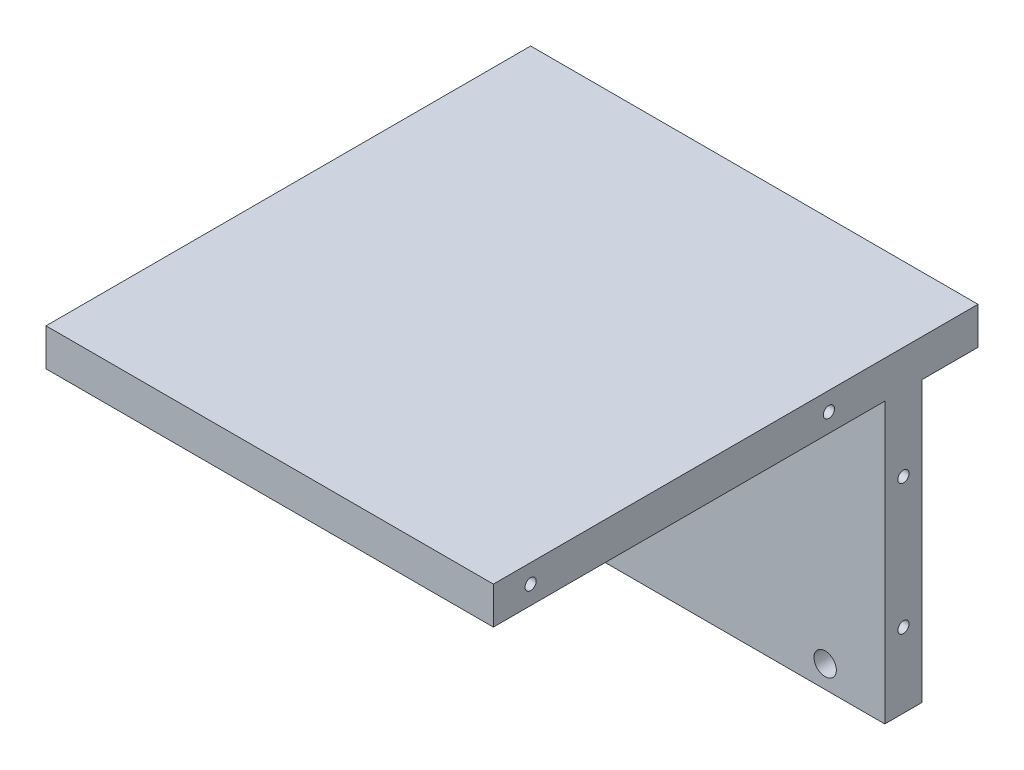
ISO-10303-21;
HEADER;
FILE_DESCRIPTION(('STEP AP214'),'2;1');
FILE_NAME('part.step','',(''),(''),'','','');
FILE_SCHEMA(('AUTOMOTIVE_DESIGN { 1 0 10303 214 1 1 1 1 }'));
ENDSEC;
DATA;
#1=APPLICATION_CONTEXT('core data for automotive mechanical design processes');
#2=APPLICATION_PROTOCOL_DEFINITION('international standard','automotive_design',2000,#1);
#3=PRODUCT_CONTEXT('',#1,'mechanical');
#4=PRODUCT('Part','Part','',(#3));
#5=PRODUCT_RELATED_PRODUCT_CATEGORY('part','',(#4));
#6=PRODUCT_DEFINITION_FORMATION('','',#4);
#7=PRODUCT_DEFINITION_CONTEXT('part definition',#1,'design');
#8=PRODUCT_DEFINITION('design','',#6,#7);
#9=PRODUCT_DEFINITION_SHAPE('','',#8);
#10=(LENGTH_UNIT() NAMED_UNIT(*) SI_UNIT(.MILLI.,.METRE.));
#11=(NAMED_UNIT(*) PLANE_ANGLE_UNIT() SI_UNIT($,.RADIAN.));
#12=(NAMED_UNIT(*) SI_UNIT($,.STERADIAN.) SOLID_ANGLE_UNIT());
#13=UNCERTAINTY_MEASURE_WITH_UNIT(LENGTH_MEASURE(1.E-05),#10,'distance_accuracy_value','');
#14=(GEOMETRIC_REPRESENTATION_CONTEXT(3) GLOBAL_UNCERTAINTY_ASSIGNED_CONTEXT((#13)) GLOBAL_UNIT_ASSIGNED_CONTEXT((#10,
#11,#12)) REPRESENTATION_CONTEXT('',''));
#15=CARTESIAN_POINT('',(0.,0.,0.));
#16=DIRECTION('',(0.,0.,1.));
#17=DIRECTION('',(1.,0.,0.));
#18=AXIS2_PLACEMENT_3D('',#15,#16,#17);
#19=CARTESIAN_POINT('',(0.,0.,10.));
#20=DIRECTION('',(0.,0.,1.));
#21=DIRECTION('',(1.,0.,0.));
#22=AXIS2_PLACEMENT_3D('',#19,#20,#21);
#23=PLANE('',#22);
#24=CARTESIAN_POINT('',(2.09489001666563E-13,-10.,10.));
#25=DIRECTION('',(0.,0.,1.));
#26=DIRECTION('',(1.,0.,0.));
#27=AXIS2_PLACEMENT_3D('',#24,#25,#26);
#28=CIRCLE('',#27,2.5);
#29=CARTESIAN_POINT('',(2.50000000000021,-10.,10.));
#30=VERTEX_POINT('',#29);
#31=EDGE_CURVE('E168',#30,#30,#28,.T.);
#32=ORIENTED_EDGE('',*,*,#31,.F.);
#33=EDGE_LOOP('',(#32));
#34=FACE_BOUND('',#33,.T.);
#35=CARTESIAN_POINT('',(0.,10.,10.));
#36=DIRECTION('',(0.,0.,1.));
#37=DIRECTION('',(1.,0.,0.));
#38=AXIS2_PLACEMENT_3D('',#35,#36,#37);
#39=CIRCLE('',#38,2.5);
#40=CARTESIAN_POINT('',(2.5,10.,10.));
#41=VERTEX_POINT('',#40);
#42=EDGE_CURVE('E162',#41,#41,#39,.T.);
#43=ORIENTED_EDGE('',*,*,#42,.F.);
#44=EDGE_LOOP('',(#43));
#45=FACE_BOUND('',#44,.T.);
#46=CARTESIAN_POINT('',(-43.9999999999993,-31.5,10.));
#47=DIRECTION('',(0.,0.,1.));
#48=DIRECTION('',(1.,0.,0.));
#49=AXIS2_PLACEMENT_3D('',#46,#47,#48);
#50=CIRCLE('',#49,3.);
#51=CARTESIAN_POINT('',(-40.9999999999993,-31.5,10.));
#52=VERTEX_POINT('',#51);
#53=EDGE_CURVE('E147',#52,#52,#50,.T.);
#54=ORIENTED_EDGE('',*,*,#53,.F.);
#55=EDGE_LOOP('',(#54));
#56=FACE_BOUND('',#55,.T.);
#57=CARTESIAN_POINT('',(-44.,31.5,10.));
#58=DIRECTION('',(0.,0.,1.));
#59=DIRECTION('',(1.,0.,0.));
#60=AXIS2_PLACEMENT_3D('',#57,#58,#59);
#61=CIRCLE('',#60,3.);
#62=CARTESIAN_POINT('',(-41.,31.5,10.));
#63=VERTEX_POINT('',#62);
#64=EDGE_CURVE('E133',#63,#63,#61,.T.);
#65=ORIENTED_EDGE('',*,*,#64,.F.);
#66=EDGE_LOOP('',(#65));
#67=FACE_BOUND('',#66,.T.);
#68=DIRECTION('',(0.,1.,0.));
#69=VECTOR('',#68,1.);
#70=CARTESIAN_POINT('',(60.,37.5,10.));
#71=LINE('',#70,#69);
#72=CARTESIAN_POINT('',(60.,-37.5,10.));
#73=VERTEX_POINT('',#72);
#74=CARTESIAN_POINT('',(60.,37.5,10.));
#75=VERTEX_POINT('',#74);
#76=EDGE_CURVE('E103',#73,#75,#71,.T.);
#77=ORIENTED_EDGE('',*,*,#76,.T.);
#78=DIRECTION('',(-1.,0.,0.));
#79=VECTOR('',#78,1.);
#80=CARTESIAN_POINT('',(-60.,37.5,10.));
#81=LINE('',#80,#79);
#82=CARTESIAN_POINT('',(-60.,37.5,10.));
#83=VERTEX_POINT('',#82);
#84=EDGE_CURVE('E89',#75,#83,#81,.T.);
#85=ORIENTED_EDGE('',*,*,#84,.T.);
#86=DIRECTION('',(0.,-1.,0.));
#87=VECTOR('',#86,1.);
#88=CARTESIAN_POINT('',(-60.,37.5,10.));
#89=LINE('',#88,#87);
#90=CARTESIAN_POINT('',(-60.,-37.5,10.));
#91=VERTEX_POINT('',#90);
#92=EDGE_CURVE('E101',#83,#91,#89,.T.);
#93=ORIENTED_EDGE('',*,*,#92,.T.);
#94=DIRECTION('',(1.,0.,0.));
#95=VECTOR('',#94,1.);
#96=CARTESIAN_POINT('',(-60.,-37.5,10.));
#97=LINE('',#96,#95);
#98=EDGE_CURVE('E54',#91,#73,#97,.T.);
#99=ORIENTED_EDGE('',*,*,#98,.T.);
#100=EDGE_LOOP('',(#77,#85,#93,#99));
#101=FACE_BOUND('',#100,.T.);
#102=CARTESIAN_POINT('',(44.,31.5,10.));
#103=DIRECTION('',(0.,0.,1.));
#104=DIRECTION('',(1.,0.,0.));
#105=AXIS2_PLACEMENT_3D('',#102,#103,#104);
#106=CIRCLE('',#105,3.);
#107=CARTESIAN_POINT('',(47.,31.5,10.));
#108=VERTEX_POINT('',#107);
#109=EDGE_CURVE('E140',#108,#108,#106,.T.);
#110=ORIENTED_EDGE('',*,*,#109,.F.);
#111=EDGE_LOOP('',(#110));
#112=FACE_BOUND('',#111,.T.);
#113=CARTESIAN_POINT('',(44.0000000000007,-31.5,10.));
#114=DIRECTION('',(0.,0.,1.));
#115=DIRECTION('',(1.,0.,0.));
#116=AXIS2_PLACEMENT_3D('',#113,#114,#115);
#117=CIRCLE('',#116,3.);
#118=CARTESIAN_POINT('',(47.0000000000007,-31.5,10.));
#119=VERTEX_POINT('',#118);
#120=EDGE_CURVE('E153',#119,#119,#117,.T.);
#121=ORIENTED_EDGE('',*,*,#120,.F.);
#122=EDGE_LOOP('',(#121));
#123=FACE_BOUND('',#122,.T.);
#124=ADVANCED_FACE('F35',(#34,#45,#56,#67,#101,#112,#123),#23,.T.);
#125=CARTESIAN_POINT('',(0.,0.,0.));
#126=DIRECTION('',(0.,0.,1.));
#127=DIRECTION('',(1.,0.,0.));
#128=AXIS2_PLACEMENT_3D('',#125,#126,#127);
#129=PLANE('',#128);
#130=CARTESIAN_POINT('',(-43.9999999999993,-31.5,0.));
#131=DIRECTION('',(0.,0.,1.));
#132=DIRECTION('',(1.,0.,0.));
#133=AXIS2_PLACEMENT_3D('',#130,#131,#132);
#134=CIRCLE('',#133,3.);
#135=CARTESIAN_POINT('',(-40.9999999999993,-31.5,0.));
#136=VERTEX_POINT('',#135);
#137=EDGE_CURVE('E150',#136,#136,#134,.T.);
#138=ORIENTED_EDGE('',*,*,#137,.T.);
#139=EDGE_LOOP('',(#138));
#140=FACE_BOUND('',#139,.T.);
#141=CARTESIAN_POINT('',(-44.,31.5,0.));
#142=DIRECTION('',(0.,0.,1.));
#143=DIRECTION('',(1.,0.,0.));
#144=AXIS2_PLACEMENT_3D('',#141,#142,#143);
#145=CIRCLE('',#144,3.);
#146=CARTESIAN_POINT('',(-41.,31.5,0.));
#147=VERTEX_POINT('',#146);
#148=EDGE_CURVE('E135',#147,#147,#145,.T.);
#149=ORIENTED_EDGE('',*,*,#148,.T.);
#150=EDGE_LOOP('',(#149));
#151=FACE_BOUND('',#150,.T.);
#152=DIRECTION('',(0.,1.,0.));
#153=VECTOR('',#152,1.);
#154=CARTESIAN_POINT('',(60.,37.5,0.));
#155=LINE('',#154,#153);
#156=CARTESIAN_POINT('',(60.,-37.5,0.));
#157=VERTEX_POINT('',#156);
#158=CARTESIAN_POINT('',(60.,37.5,0.));
#159=VERTEX_POINT('',#158);
#160=EDGE_CURVE('E119',#157,#159,#155,.T.);
#161=ORIENTED_EDGE('',*,*,#160,.F.);
#162=DIRECTION('',(1.,0.,0.));
#163=VECTOR('',#162,1.);
#164=CARTESIAN_POINT('',(-60.,-37.5,0.));
#165=LINE('',#164,#163);
#166=CARTESIAN_POINT('',(-60.,-37.5,0.));
#167=VERTEX_POINT('',#166);
#168=EDGE_CURVE('E113',#167,#157,#165,.T.);
#169=ORIENTED_EDGE('',*,*,#168,.F.);
#170=DIRECTION('',(0.,-1.,0.));
#171=VECTOR('',#170,1.);
#172=CARTESIAN_POINT('',(-60.,37.5,0.));
#173=LINE('',#172,#171);
#174=CARTESIAN_POINT('',(-60.,37.5,0.));
#175=VERTEX_POINT('',#174);
#176=EDGE_CURVE('E66',#175,#167,#173,.T.);
#177=ORIENTED_EDGE('',*,*,#176,.F.);
#178=DIRECTION('',(-1.,0.,0.));
#179=VECTOR('',#178,1.);
#180=CARTESIAN_POINT('',(-60.,37.5,0.));
#181=LINE('',#180,#179);
#182=EDGE_CURVE('E116',#159,#175,#181,.T.);
#183=ORIENTED_EDGE('',*,*,#182,.F.);
#184=EDGE_LOOP('',(#161,#169,#177,#183));
#185=FACE_BOUND('',#184,.T.);
#186=CARTESIAN_POINT('',(44.,31.5,0.));
#187=DIRECTION('',(0.,0.,1.));
#188=DIRECTION('',(1.,0.,0.));
#189=AXIS2_PLACEMENT_3D('',#186,#187,#188);
#190=CIRCLE('',#189,3.);
#191=CARTESIAN_POINT('',(47.,31.5,0.));
#192=VERTEX_POINT('',#191);
#193=EDGE_CURVE('E143',#192,#192,#190,.T.);
#194=ORIENTED_EDGE('',*,*,#193,.T.);
#195=EDGE_LOOP('',(#194));
#196=FACE_BOUND('',#195,.T.);
#197=CARTESIAN_POINT('',(44.0000000000007,-31.5,0.));
#198=DIRECTION('',(0.,0.,1.));
#199=DIRECTION('',(1.,0.,0.));
#200=AXIS2_PLACEMENT_3D('',#197,#198,#199);
#201=CIRCLE('',#200,3.);
#202=CARTESIAN_POINT('',(47.0000000000007,-31.5,0.));
#203=VERTEX_POINT('',#202);
#204=EDGE_CURVE('E156',#203,#203,#201,.T.);
#205=ORIENTED_EDGE('',*,*,#204,.T.);
#206=EDGE_LOOP('',(#205));
#207=FACE_BOUND('',#206,.T.);
#208=ADVANCED_FACE('F131',(#140,#151,#185,#196,#207),#129,.F.);
#209=CARTESIAN_POINT('',(60.,37.5,10.));
#210=DIRECTION('',(-1.,0.,0.));
#211=DIRECTION('',(0.,-1.,0.));
#212=AXIS2_PLACEMENT_3D('',#209,#210,#211);
#213=PLANE('',#212);
#214=CARTESIAN_POINT('',(60.,42.5,25.));
#215=DIRECTION('',(1.,0.,0.));
#216=DIRECTION('',(0.,1.,0.));
#217=AXIS2_PLACEMENT_3D('',#214,#215,#216);
#218=CIRCLE('',#217,1.5);
#219=CARTESIAN_POINT('',(60.,44.,25.));
#220=VERTEX_POINT('',#219);
#221=EDGE_CURVE('E240',#220,#220,#218,.T.);
#222=ORIENTED_EDGE('',*,*,#221,.F.);
#223=EDGE_LOOP('',(#222));
#224=FACE_BOUND('',#223,.T.);
#225=CARTESIAN_POINT('',(60.,42.5,105.));
#226=DIRECTION('',(1.,0.,0.));
#227=DIRECTION('',(0.,1.,0.));
#228=AXIS2_PLACEMENT_3D('',#225,#226,#227);
#229=CIRCLE('',#228,1.5);
#230=CARTESIAN_POINT('',(60.,44.,105.));
#231=VERTEX_POINT('',#230);
#232=EDGE_CURVE('E234',#231,#231,#229,.T.);
#233=ORIENTED_EDGE('',*,*,#232,.F.);
#234=EDGE_LOOP('',(#233));
#235=FACE_BOUND('',#234,.T.);
#236=CARTESIAN_POINT('',(60.,-17.5,4.99999999999963));
#237=DIRECTION('',(1.,0.,0.));
#238=DIRECTION('',(0.,1.,0.));
#239=AXIS2_PLACEMENT_3D('',#236,#237,#238);
#240=CIRCLE('',#239,1.5);
#241=CARTESIAN_POINT('',(60.,-16.,4.99999999999963));
#242=VERTEX_POINT('',#241);
#243=EDGE_CURVE('E180',#242,#242,#240,.T.);
#244=ORIENTED_EDGE('',*,*,#243,.F.);
#245=EDGE_LOOP('',(#244));
#246=FACE_BOUND('',#245,.T.);
#247=CARTESIAN_POINT('',(60.,17.5,5.));
#248=DIRECTION('',(1.,0.,0.));
#249=DIRECTION('',(0.,1.,0.));
#250=AXIS2_PLACEMENT_3D('',#247,#248,#249);
#251=CIRCLE('',#250,1.5);
#252=CARTESIAN_POINT('',(60.,19.,5.));
#253=VERTEX_POINT('',#252);
#254=EDGE_CURVE('E174',#253,#253,#251,.T.);
#255=ORIENTED_EDGE('',*,*,#254,.F.);
#256=EDGE_LOOP('',(#255));
#257=FACE_BOUND('',#256,.T.);
#258=ORIENTED_EDGE('',*,*,#160,.T.);
#259=DIRECTION('',(0.,0.,-1.));
#260=VECTOR('',#259,1.);
#261=CARTESIAN_POINT('',(60.,37.5,-15.));
#262=LINE('',#261,#260);
#263=CARTESIAN_POINT('',(60.,37.5,-15.));
#264=VERTEX_POINT('',#263);
#265=EDGE_CURVE('E75',#159,#264,#262,.T.);
#266=ORIENTED_EDGE('',*,*,#265,.T.);
#267=DIRECTION('',(0.,-1.,0.));
#268=VECTOR('',#267,1.);
#269=CARTESIAN_POINT('',(60.,47.5,-15.));
#270=LINE('',#269,#268);
#271=CARTESIAN_POINT('',(60.,47.5,-15.));
#272=VERTEX_POINT('',#271);
#273=EDGE_CURVE('E213',#272,#264,#270,.T.);
#274=ORIENTED_EDGE('',*,*,#273,.F.);
#275=DIRECTION('',(0.,0.,-1.));
#276=VECTOR('',#275,1.);
#277=CARTESIAN_POINT('',(60.,47.5,-15.));
#278=LINE('',#277,#276);
#279=CARTESIAN_POINT('',(60.,47.5,115.));
#280=VERTEX_POINT('',#279);
#281=EDGE_CURVE('E226',#280,#272,#278,.T.);
#282=ORIENTED_EDGE('',*,*,#281,.F.);
#283=DIRECTION('',(0.,-1.,0.));
#284=VECTOR('',#283,1.);
#285=CARTESIAN_POINT('',(60.,47.5,115.));
#286=LINE('',#285,#284);
#287=CARTESIAN_POINT('',(60.,37.5,115.));
#288=VERTEX_POINT('',#287);
#289=EDGE_CURVE('E217',#280,#288,#286,.T.);
#290=ORIENTED_EDGE('',*,*,#289,.T.);
#291=EDGE_CURVE('E200',#288,#75,#262,.T.);
#292=ORIENTED_EDGE('',*,*,#291,.T.);
#293=ORIENTED_EDGE('',*,*,#76,.F.);
#294=DIRECTION('',(0.,0.,-1.));
#295=VECTOR('',#294,1.);
#296=CARTESIAN_POINT('',(60.,-37.5,10.));
#297=LINE('',#296,#295);
#298=EDGE_CURVE('E45',#73,#157,#297,.T.);
#299=ORIENTED_EDGE('',*,*,#298,.T.);
#300=EDGE_LOOP('',(#258,#266,#274,#282,#290,#292,#293,#299));
#301=FACE_BOUND('',#300,.T.);
#302=ADVANCED_FACE('F37',(#224,#235,#246,#257,#301),#213,.F.);
#303=CARTESIAN_POINT('',(-60.,37.5,10.));
#304=DIRECTION('',(1.,0.,0.));
#305=DIRECTION('',(0.,1.,0.));
#306=AXIS2_PLACEMENT_3D('',#303,#304,#305);
#307=PLANE('',#306);
#308=CARTESIAN_POINT('',(-60.,42.5,25.));
#309=DIRECTION('',(1.,0.,0.));
#310=DIRECTION('',(0.,1.,0.));
#311=AXIS2_PLACEMENT_3D('',#308,#309,#310);
#312=CIRCLE('',#311,1.5);
#313=CARTESIAN_POINT('',(-60.,44.,25.));
#314=VERTEX_POINT('',#313);
#315=EDGE_CURVE('E249',#314,#314,#312,.T.);
#316=ORIENTED_EDGE('',*,*,#315,.T.);
#317=EDGE_LOOP('',(#316));
#318=FACE_BOUND('',#317,.T.);
#319=CARTESIAN_POINT('',(-60.,42.5,105.));
#320=DIRECTION('',(1.,0.,0.));
#321=DIRECTION('',(0.,1.,0.));
#322=AXIS2_PLACEMENT_3D('',#319,#320,#321);
#323=CIRCLE('',#322,1.5);
#324=CARTESIAN_POINT('',(-60.,44.,105.));
#325=VERTEX_POINT('',#324);
#326=EDGE_CURVE('E243',#325,#325,#323,.T.);
#327=ORIENTED_EDGE('',*,*,#326,.T.);
#328=EDGE_LOOP('',(#327));
#329=FACE_BOUND('',#328,.T.);
#330=CARTESIAN_POINT('',(-60.,-17.5,4.99999999999963));
#331=DIRECTION('',(1.,0.,0.));
#332=DIRECTION('',(0.,1.,0.));
#333=AXIS2_PLACEMENT_3D('',#330,#331,#332);
#334=CIRCLE('',#333,1.5);
#335=CARTESIAN_POINT('',(-60.,-16.,4.99999999999963));
#336=VERTEX_POINT('',#335);
#337=EDGE_CURVE('E189',#336,#336,#334,.T.);
#338=ORIENTED_EDGE('',*,*,#337,.T.);
#339=EDGE_LOOP('',(#338));
#340=FACE_BOUND('',#339,.T.);
#341=CARTESIAN_POINT('',(-60.,17.5,5.));
#342=DIRECTION('',(1.,0.,0.));
#343=DIRECTION('',(0.,1.,0.));
#344=AXIS2_PLACEMENT_3D('',#341,#342,#343);
#345=CIRCLE('',#344,1.5);
#346=CARTESIAN_POINT('',(-60.,19.,5.));
#347=VERTEX_POINT('',#346);
#348=EDGE_CURVE('E183',#347,#347,#345,.T.);
#349=ORIENTED_EDGE('',*,*,#348,.T.);
#350=EDGE_LOOP('',(#349));
#351=FACE_BOUND('',#350,.T.);
#352=ORIENTED_EDGE('',*,*,#176,.T.);
#353=DIRECTION('',(0.,0.,-1.));
#354=VECTOR('',#353,1.);
#355=CARTESIAN_POINT('',(-60.,-37.5,10.));
#356=LINE('',#355,#354);
#357=EDGE_CURVE('E11',#91,#167,#356,.T.);
#358=ORIENTED_EDGE('',*,*,#357,.F.);
#359=ORIENTED_EDGE('',*,*,#92,.F.);
#360=DIRECTION('',(0.,0.,1.));
#361=VECTOR('',#360,1.);
#362=CARTESIAN_POINT('',(-60.,37.5,-15.));
#363=LINE('',#362,#361);
#364=CARTESIAN_POINT('',(-60.,37.5,115.));
#365=VERTEX_POINT('',#364);
#366=EDGE_CURVE('E85',#83,#365,#363,.T.);
#367=ORIENTED_EDGE('',*,*,#366,.T.);
#368=DIRECTION('',(0.,-1.,0.));
#369=VECTOR('',#368,1.);
#370=CARTESIAN_POINT('',(-60.,47.5,115.));
#371=LINE('',#370,#369);
#372=CARTESIAN_POINT('',(-60.,47.5,115.));
#373=VERTEX_POINT('',#372);
#374=EDGE_CURVE('E195',#373,#365,#371,.T.);
#375=ORIENTED_EDGE('',*,*,#374,.F.);
#376=DIRECTION('',(0.,0.,1.));
#377=VECTOR('',#376,1.);
#378=CARTESIAN_POINT('',(-60.,47.5,-15.));
#379=LINE('',#378,#377);
#380=CARTESIAN_POINT('',(-60.,47.5,-15.));
#381=VERTEX_POINT('',#380);
#382=EDGE_CURVE('E209',#381,#373,#379,.T.);
#383=ORIENTED_EDGE('',*,*,#382,.F.);
#384=DIRECTION('',(0.,-1.,0.));
#385=VECTOR('',#384,1.);
#386=CARTESIAN_POINT('',(-60.,47.5,-15.));
#387=LINE('',#386,#385);
#388=CARTESIAN_POINT('',(-60.,37.5,-15.));
#389=VERTEX_POINT('',#388);
#390=EDGE_CURVE('E210',#381,#389,#387,.T.);
#391=ORIENTED_EDGE('',*,*,#390,.T.);
#392=EDGE_CURVE('E97',#389,#175,#363,.T.);
#393=ORIENTED_EDGE('',*,*,#392,.T.);
#394=EDGE_LOOP('',(#352,#358,#359,#367,#375,#383,#391,#393));
#395=FACE_BOUND('',#394,.T.);
#396=ADVANCED_FACE('F105',(#318,#329,#340,#351,#395),#307,.F.);
#397=CARTESIAN_POINT('',(-60.,-37.5,10.));
#398=DIRECTION('',(0.,1.,0.));
#399=DIRECTION('',(0.,0.,1.));
#400=AXIS2_PLACEMENT_3D('',#397,#398,#399);
#401=PLANE('',#400);
#402=ORIENTED_EDGE('',*,*,#168,.T.);
#403=ORIENTED_EDGE('',*,*,#298,.F.);
#404=ORIENTED_EDGE('',*,*,#98,.F.);
#405=ORIENTED_EDGE('',*,*,#357,.T.);
#406=EDGE_LOOP('',(#402,#403,#404,#405));
#407=FACE_BOUND('',#406,.T.);
#408=ADVANCED_FACE('F286',(#407),#401,.F.);
#409=CARTESIAN_POINT('',(-44.,31.5,10.));
#410=DIRECTION('',(0.,0.,-1.));
#411=DIRECTION('',(-1.,0.,0.));
#412=AXIS2_PLACEMENT_3D('',#409,#410,#411);
#413=CYLINDRICAL_SURFACE('',#412,3.);
#414=ORIENTED_EDGE('',*,*,#64,.T.);
#415=EDGE_LOOP('',(#414));
#416=FACE_BOUND('',#415,.T.);
#417=ORIENTED_EDGE('',*,*,#148,.F.);
#418=EDGE_LOOP('',(#417));
#419=FACE_BOUND('',#418,.T.);
#420=ADVANCED_FACE('F283',(#416,#419),#413,.F.);
#421=CARTESIAN_POINT('',(44.,31.5,10.));
#422=DIRECTION('',(0.,0.,-1.));
#423=DIRECTION('',(-1.,0.,0.));
#424=AXIS2_PLACEMENT_3D('',#421,#422,#423);
#425=CYLINDRICAL_SURFACE('',#424,3.);
#426=ORIENTED_EDGE('',*,*,#109,.T.);
#427=EDGE_LOOP('',(#426));
#428=FACE_BOUND('',#427,.T.);
#429=ORIENTED_EDGE('',*,*,#193,.F.);
#430=EDGE_LOOP('',(#429));
#431=FACE_BOUND('',#430,.T.);
#432=ADVANCED_FACE('F339',(#428,#431),#425,.F.);
#433=CARTESIAN_POINT('',(-43.9999999999993,-31.5,10.));
#434=DIRECTION('',(0.,0.,-1.));
#435=DIRECTION('',(-1.,0.,0.));
#436=AXIS2_PLACEMENT_3D('',#433,#434,#435);
#437=CYLINDRICAL_SURFACE('',#436,3.);
#438=ORIENTED_EDGE('',*,*,#53,.T.);
#439=EDGE_LOOP('',(#438));
#440=FACE_BOUND('',#439,.T.);
#441=ORIENTED_EDGE('',*,*,#137,.F.);
#442=EDGE_LOOP('',(#441));
#443=FACE_BOUND('',#442,.T.);
#444=ADVANCED_FACE('F336',(#440,#443),#437,.F.);
#445=CARTESIAN_POINT('',(44.0000000000007,-31.5,10.));
#446=DIRECTION('',(0.,0.,-1.));
#447=DIRECTION('',(-1.,0.,0.));
#448=AXIS2_PLACEMENT_3D('',#445,#446,#447);
#449=CYLINDRICAL_SURFACE('',#448,3.);
#450=ORIENTED_EDGE('',*,*,#120,.T.);
#451=EDGE_LOOP('',(#450));
#452=FACE_BOUND('',#451,.T.);
#453=ORIENTED_EDGE('',*,*,#204,.F.);
#454=EDGE_LOOP('',(#453));
#455=FACE_BOUND('',#454,.T.);
#456=ADVANCED_FACE('F332',(#452,#455),#449,.F.);
#457=CARTESIAN_POINT('',(0.,10.,3.));
#458=DIRECTION('',(0.,0.,1.));
#459=DIRECTION('',(1.,0.,0.));
#460=AXIS2_PLACEMENT_3D('',#457,#458,#459);
#461=CYLINDRICAL_SURFACE('',#460,2.5);
#462=CARTESIAN_POINT('',(0.,10.,3.));
#463=DIRECTION('',(0.,0.,1.));
#464=DIRECTION('',(1.,0.,0.));
#465=AXIS2_PLACEMENT_3D('',#462,#463,#464);
#466=CIRCLE('',#465,2.5);
#467=CARTESIAN_POINT('',(2.5,10.,3.));
#468=VERTEX_POINT('',#467);
#469=EDGE_CURVE('E159',#468,#468,#466,.T.);
#470=ORIENTED_EDGE('',*,*,#469,.F.);
#471=EDGE_LOOP('',(#470));
#472=FACE_BOUND('',#471,.T.);
#473=ORIENTED_EDGE('',*,*,#42,.T.);
#474=EDGE_LOOP('',(#473));
#475=FACE_BOUND('',#474,.T.);
#476=ADVANCED_FACE('F328',(#472,#475),#461,.F.);
#477=CARTESIAN_POINT('',(0.,10.,3.));
#478=DIRECTION('',(0.,0.,1.));
#479=DIRECTION('',(1.,0.,0.));
#480=AXIS2_PLACEMENT_3D('',#477,#478,#479);
#481=PLANE('',#480);
#482=ORIENTED_EDGE('',*,*,#469,.T.);
#483=EDGE_LOOP('',(#482));
#484=FACE_BOUND('',#483,.T.);
#485=ADVANCED_FACE('F324',(#484),#481,.T.);
#486=CARTESIAN_POINT('',(2.09489001666563E-13,-10.,3.));
#487=DIRECTION('',(0.,0.,1.));
#488=DIRECTION('',(1.,0.,0.));
#489=AXIS2_PLACEMENT_3D('',#486,#487,#488);
#490=CYLINDRICAL_SURFACE('',#489,2.5);
#491=CARTESIAN_POINT('',(2.09489001666563E-13,-10.,3.));
#492=DIRECTION('',(0.,0.,1.));
#493=DIRECTION('',(1.,0.,0.));
#494=AXIS2_PLACEMENT_3D('',#491,#492,#493);
#495=CIRCLE('',#494,2.5);
#496=CARTESIAN_POINT('',(2.50000000000021,-10.,3.));
#497=VERTEX_POINT('',#496);
#498=EDGE_CURVE('E165',#497,#497,#495,.T.);
#499=ORIENTED_EDGE('',*,*,#498,.F.);
#500=EDGE_LOOP('',(#499));
#501=FACE_BOUND('',#500,.T.);
#502=ORIENTED_EDGE('',*,*,#31,.T.);
#503=EDGE_LOOP('',(#502));
#504=FACE_BOUND('',#503,.T.);
#505=ADVANCED_FACE('F316',(#501,#504),#490,.F.);
#506=CARTESIAN_POINT('',(2.09489001666563E-13,-10.,3.));
#507=DIRECTION('',(0.,0.,1.));
#508=DIRECTION('',(1.,0.,0.));
#509=AXIS2_PLACEMENT_3D('',#506,#507,#508);
#510=PLANE('',#509);
#511=ORIENTED_EDGE('',*,*,#498,.T.);
#512=EDGE_LOOP('',(#511));
#513=FACE_BOUND('',#512,.T.);
#514=ADVANCED_FACE('F306',(#513),#510,.T.);
#515=CARTESIAN_POINT('',(50.,17.5,5.));
#516=DIRECTION('',(1.,0.,0.));
#517=DIRECTION('',(0.,1.,0.));
#518=AXIS2_PLACEMENT_3D('',#515,#516,#517);
#519=CYLINDRICAL_SURFACE('',#518,1.5);
#520=CARTESIAN_POINT('',(50.,17.5,5.));
#521=DIRECTION('',(1.,0.,0.));
#522=DIRECTION('',(0.,1.,0.));
#523=AXIS2_PLACEMENT_3D('',#520,#521,#522);
#524=CIRCLE('',#523,1.5);
#525=CARTESIAN_POINT('',(50.,19.,5.));
#526=VERTEX_POINT('',#525);
#527=EDGE_CURVE('E171',#526,#526,#524,.T.);
#528=ORIENTED_EDGE('',*,*,#527,.F.);
#529=EDGE_LOOP('',(#528));
#530=FACE_BOUND('',#529,.T.);
#531=ORIENTED_EDGE('',*,*,#254,.T.);
#532=EDGE_LOOP('',(#531));
#533=FACE_BOUND('',#532,.T.);
#534=ADVANCED_FACE('F303',(#530,#533),#519,.F.);
#535=CARTESIAN_POINT('',(50.,17.5,5.));
#536=DIRECTION('',(1.,0.,0.));
#537=DIRECTION('',(0.,1.,0.));
#538=AXIS2_PLACEMENT_3D('',#535,#536,#537);
#539=PLANE('',#538);
#540=ORIENTED_EDGE('',*,*,#527,.T.);
#541=EDGE_LOOP('',(#540));
#542=FACE_BOUND('',#541,.T.);
#543=ADVANCED_FACE('F305',(#542),#539,.T.);
#544=CARTESIAN_POINT('',(50.,-17.5,4.99999999999963));
#545=DIRECTION('',(1.,0.,0.));
#546=DIRECTION('',(0.,1.,0.));
#547=AXIS2_PLACEMENT_3D('',#544,#545,#546);
#548=CYLINDRICAL_SURFACE('',#547,1.5);
#549=CARTESIAN_POINT('',(50.,-17.5,4.99999999999963));
#550=DIRECTION('',(1.,0.,0.));
#551=DIRECTION('',(0.,1.,0.));
#552=AXIS2_PLACEMENT_3D('',#549,#550,#551);
#553=CIRCLE('',#552,1.5);
#554=CARTESIAN_POINT('',(50.,-16.,4.99999999999963));
#555=VERTEX_POINT('',#554);
#556=EDGE_CURVE('E177',#555,#555,#553,.T.);
#557=ORIENTED_EDGE('',*,*,#556,.F.);
#558=EDGE_LOOP('',(#557));
#559=FACE_BOUND('',#558,.T.);
#560=ORIENTED_EDGE('',*,*,#243,.T.);
#561=EDGE_LOOP('',(#560));
#562=FACE_BOUND('',#561,.T.);
#563=ADVANCED_FACE('F313',(#559,#562),#548,.F.);
#564=CARTESIAN_POINT('',(50.,-17.5,4.99999999999963));
#565=DIRECTION('',(1.,0.,0.));
#566=DIRECTION('',(0.,1.,0.));
#567=AXIS2_PLACEMENT_3D('',#564,#565,#566);
#568=PLANE('',#567);
#569=ORIENTED_EDGE('',*,*,#556,.T.);
#570=EDGE_LOOP('',(#569));
#571=FACE_BOUND('',#570,.T.);
#572=ADVANCED_FACE('F423',(#571),#568,.T.);
#573=CARTESIAN_POINT('',(-60.,17.5,5.));
#574=DIRECTION('',(1.,0.,0.));
#575=DIRECTION('',(0.,1.,0.));
#576=AXIS2_PLACEMENT_3D('',#573,#574,#575);
#577=CYLINDRICAL_SURFACE('',#576,1.5);
#578=ORIENTED_EDGE('',*,*,#348,.F.);
#579=EDGE_LOOP('',(#578));
#580=FACE_BOUND('',#579,.T.);
#581=CARTESIAN_POINT('',(-50.,17.5,5.));
#582=DIRECTION('',(1.,0.,0.));
#583=DIRECTION('',(0.,1.,0.));
#584=AXIS2_PLACEMENT_3D('',#581,#582,#583);
#585=CIRCLE('',#584,1.5);
#586=CARTESIAN_POINT('',(-50.,19.,5.));
#587=VERTEX_POINT('',#586);
#588=EDGE_CURVE('E186',#587,#587,#585,.T.);
#589=ORIENTED_EDGE('',*,*,#588,.T.);
#590=EDGE_LOOP('',(#589));
#591=FACE_BOUND('',#590,.T.);
#592=ADVANCED_FACE('F431',(#580,#591),#577,.F.);
#593=CARTESIAN_POINT('',(-50.,17.5,5.));
#594=DIRECTION('',(1.,0.,0.));
#595=DIRECTION('',(0.,1.,0.));
#596=AXIS2_PLACEMENT_3D('',#593,#594,#595);
#597=PLANE('',#596);
#598=ORIENTED_EDGE('',*,*,#588,.F.);
#599=EDGE_LOOP('',(#598));
#600=FACE_BOUND('',#599,.T.);
#601=ADVANCED_FACE('F440',(#600),#597,.F.);
#602=CARTESIAN_POINT('',(-60.,-17.5,4.99999999999963));
#603=DIRECTION('',(1.,0.,0.));
#604=DIRECTION('',(0.,1.,0.));
#605=AXIS2_PLACEMENT_3D('',#602,#603,#604);
#606=CYLINDRICAL_SURFACE('',#605,1.5);
#607=ORIENTED_EDGE('',*,*,#337,.F.);
#608=EDGE_LOOP('',(#607));
#609=FACE_BOUND('',#608,.T.);
#610=CARTESIAN_POINT('',(-50.,-17.5,4.99999999999963));
#611=DIRECTION('',(1.,0.,0.));
#612=DIRECTION('',(0.,1.,0.));
#613=AXIS2_PLACEMENT_3D('',#610,#611,#612);
#614=CIRCLE('',#613,1.5);
#615=CARTESIAN_POINT('',(-50.,-16.,4.99999999999963));
#616=VERTEX_POINT('',#615);
#617=EDGE_CURVE('E192',#616,#616,#614,.T.);
#618=ORIENTED_EDGE('',*,*,#617,.T.);
#619=EDGE_LOOP('',(#618));
#620=FACE_BOUND('',#619,.T.);
#621=ADVANCED_FACE('F449',(#609,#620),#606,.F.);
#622=CARTESIAN_POINT('',(-50.,-17.5,4.99999999999963));
#623=DIRECTION('',(1.,0.,0.));
#624=DIRECTION('',(0.,1.,0.));
#625=AXIS2_PLACEMENT_3D('',#622,#623,#624);
#626=PLANE('',#625);
#627=ORIENTED_EDGE('',*,*,#617,.F.);
#628=EDGE_LOOP('',(#627));
#629=FACE_BOUND('',#628,.T.);
#630=ADVANCED_FACE('F458',(#629),#626,.F.);
#631=CARTESIAN_POINT('',(0.,37.5,0.));
#632=DIRECTION('',(0.,1.,0.));
#633=DIRECTION('',(0.,0.,1.));
#634=AXIS2_PLACEMENT_3D('',#631,#632,#633);
#635=PLANE('',#634);
#636=ORIENTED_EDGE('',*,*,#265,.F.);
#637=ORIENTED_EDGE('',*,*,#182,.T.);
#638=ORIENTED_EDGE('',*,*,#392,.F.);
#639=DIRECTION('',(-1.,0.,0.));
#640=VECTOR('',#639,1.);
#641=CARTESIAN_POINT('',(-60.,37.5,-15.));
#642=LINE('',#641,#640);
#643=EDGE_CURVE('E205',#264,#389,#642,.T.);
#644=ORIENTED_EDGE('',*,*,#643,.F.);
#645=EDGE_LOOP('',(#636,#637,#638,#644));
#646=FACE_BOUND('',#645,.T.);
#647=ADVANCED_FACE('F467',(#646),#635,.F.);
#648=CARTESIAN_POINT('',(-60.,47.5,115.));
#649=DIRECTION('',(0.,0.,-1.));
#650=DIRECTION('',(-1.,0.,0.));
#651=AXIS2_PLACEMENT_3D('',#648,#649,#650);
#652=PLANE('',#651);
#653=DIRECTION('',(1.,0.,0.));
#654=VECTOR('',#653,1.);
#655=CARTESIAN_POINT('',(-60.,37.5,115.));
#656=LINE('',#655,#654);
#657=EDGE_CURVE('E93',#365,#288,#656,.T.);
#658=ORIENTED_EDGE('',*,*,#657,.T.);
#659=ORIENTED_EDGE('',*,*,#289,.F.);
#660=DIRECTION('',(1.,0.,0.));
#661=VECTOR('',#660,1.);
#662=CARTESIAN_POINT('',(-60.,47.5,115.));
#663=LINE('',#662,#661);
#664=EDGE_CURVE('E229',#373,#280,#663,.T.);
#665=ORIENTED_EDGE('',*,*,#664,.F.);
#666=ORIENTED_EDGE('',*,*,#374,.T.);
#667=EDGE_LOOP('',(#658,#659,#665,#666));
#668=FACE_BOUND('',#667,.T.);
#669=ADVANCED_FACE('F490',(#668),#652,.F.);
#670=CARTESIAN_POINT('',(-60.,47.5,-15.));
#671=DIRECTION('',(0.,0.,1.));
#672=DIRECTION('',(1.,0.,0.));
#673=AXIS2_PLACEMENT_3D('',#670,#671,#672);
#674=PLANE('',#673);
#675=ORIENTED_EDGE('',*,*,#643,.T.);
#676=ORIENTED_EDGE('',*,*,#390,.F.);
#677=DIRECTION('',(-1.,0.,0.));
#678=VECTOR('',#677,1.);
#679=CARTESIAN_POINT('',(-60.,47.5,-15.));
#680=LINE('',#679,#678);
#681=EDGE_CURVE('E214',#272,#381,#680,.T.);
#682=ORIENTED_EDGE('',*,*,#681,.F.);
#683=ORIENTED_EDGE('',*,*,#273,.T.);
#684=EDGE_LOOP('',(#675,#676,#682,#683));
#685=FACE_BOUND('',#684,.T.);
#686=ADVANCED_FACE('F499',(#685),#674,.F.);
#687=CARTESIAN_POINT('',(0.,47.5,0.));
#688=DIRECTION('',(0.,1.,0.));
#689=DIRECTION('',(0.,0.,1.));
#690=AXIS2_PLACEMENT_3D('',#687,#688,#689);
#691=PLANE('',#690);
#692=ORIENTED_EDGE('',*,*,#382,.T.);
#693=ORIENTED_EDGE('',*,*,#664,.T.);
#694=ORIENTED_EDGE('',*,*,#281,.T.);
#695=ORIENTED_EDGE('',*,*,#681,.T.);
#696=EDGE_LOOP('',(#692,#693,#694,#695));
#697=FACE_BOUND('',#696,.T.);
#698=ADVANCED_FACE('F508',(#697),#691,.T.);
#699=ORIENTED_EDGE('',*,*,#84,.F.);
#700=ORIENTED_EDGE('',*,*,#291,.F.);
#701=ORIENTED_EDGE('',*,*,#657,.F.);
#702=ORIENTED_EDGE('',*,*,#366,.F.);
#703=EDGE_LOOP('',(#699,#700,#701,#702));
#704=FACE_BOUND('',#703,.T.);
#705=ADVANCED_FACE('F87',(#704),#635,.F.);
#706=CARTESIAN_POINT('',(50.,42.5,105.));
#707=DIRECTION('',(1.,0.,0.));
#708=DIRECTION('',(0.,1.,0.));
#709=AXIS2_PLACEMENT_3D('',#706,#707,#708);
#710=CYLINDRICAL_SURFACE('',#709,1.5);
#711=CARTESIAN_POINT('',(50.,42.5,105.));
#712=DIRECTION('',(1.,0.,0.));
#713=DIRECTION('',(0.,1.,0.));
#714=AXIS2_PLACEMENT_3D('',#711,#712,#713);
#715=CIRCLE('',#714,1.5);
#716=CARTESIAN_POINT('',(50.,44.,105.));
#717=VERTEX_POINT('',#716);
#718=EDGE_CURVE('E98',#717,#717,#715,.T.);
#719=ORIENTED_EDGE('',*,*,#718,.F.);
#720=EDGE_LOOP('',(#719));
#721=FACE_BOUND('',#720,.T.);
#722=ORIENTED_EDGE('',*,*,#232,.T.);
#723=EDGE_LOOP('',(#722));
#724=FACE_BOUND('',#723,.T.);
#725=ADVANCED_FACE('F524',(#721,#724),#710,.F.);
#726=CARTESIAN_POINT('',(50.,42.5,105.));
#727=DIRECTION('',(1.,0.,0.));
#728=DIRECTION('',(0.,1.,0.));
#729=AXIS2_PLACEMENT_3D('',#726,#727,#728);
#730=PLANE('',#729);
#731=ORIENTED_EDGE('',*,*,#718,.T.);
#732=EDGE_LOOP('',(#731));
#733=FACE_BOUND('',#732,.T.);
#734=ADVANCED_FACE('F530',(#733),#730,.T.);
#735=CARTESIAN_POINT('',(50.,42.5,25.));
#736=DIRECTION('',(1.,0.,0.));
#737=DIRECTION('',(0.,1.,0.));
#738=AXIS2_PLACEMENT_3D('',#735,#736,#737);
#739=CYLINDRICAL_SURFACE('',#738,1.5);
#740=CARTESIAN_POINT('',(50.,42.5,25.));
#741=DIRECTION('',(1.,0.,0.));
#742=DIRECTION('',(0.,1.,0.));
#743=AXIS2_PLACEMENT_3D('',#740,#741,#742);
#744=CIRCLE('',#743,1.5);
#745=CARTESIAN_POINT('',(50.,44.,25.));
#746=VERTEX_POINT('',#745);
#747=EDGE_CURVE('E237',#746,#746,#744,.T.);
#748=ORIENTED_EDGE('',*,*,#747,.F.);
#749=EDGE_LOOP('',(#748));
#750=FACE_BOUND('',#749,.T.);
#751=ORIENTED_EDGE('',*,*,#221,.T.);
#752=EDGE_LOOP('',(#751));
#753=FACE_BOUND('',#752,.T.);
#754=ADVANCED_FACE('F539',(#750,#753),#739,.F.);
#755=CARTESIAN_POINT('',(50.,42.5,25.));
#756=DIRECTION('',(1.,0.,0.));
#757=DIRECTION('',(0.,1.,0.));
#758=AXIS2_PLACEMENT_3D('',#755,#756,#757);
#759=PLANE('',#758);
#760=ORIENTED_EDGE('',*,*,#747,.T.);
#761=EDGE_LOOP('',(#760));
#762=FACE_BOUND('',#761,.T.);
#763=ADVANCED_FACE('F548',(#762),#759,.T.);
#764=CARTESIAN_POINT('',(-60.,42.5,105.));
#765=DIRECTION('',(1.,0.,0.));
#766=DIRECTION('',(0.,1.,0.));
#767=AXIS2_PLACEMENT_3D('',#764,#765,#766);
#768=CYLINDRICAL_SURFACE('',#767,1.5);
#769=ORIENTED_EDGE('',*,*,#326,.F.);
#770=EDGE_LOOP('',(#769));
#771=FACE_BOUND('',#770,.T.);
#772=CARTESIAN_POINT('',(-50.,42.5,105.));
#773=DIRECTION('',(1.,0.,0.));
#774=DIRECTION('',(0.,1.,0.));
#775=AXIS2_PLACEMENT_3D('',#772,#773,#774);
#776=CIRCLE('',#775,1.5);
#777=CARTESIAN_POINT('',(-50.,44.,105.));
#778=VERTEX_POINT('',#777);
#779=EDGE_CURVE('E246',#778,#778,#776,.T.);
#780=ORIENTED_EDGE('',*,*,#779,.T.);
#781=EDGE_LOOP('',(#780));
#782=FACE_BOUND('',#781,.T.);
#783=ADVANCED_FACE('F556',(#771,#782),#768,.F.);
#784=CARTESIAN_POINT('',(-50.,42.5,105.));
#785=DIRECTION('',(1.,0.,0.));
#786=DIRECTION('',(0.,1.,0.));
#787=AXIS2_PLACEMENT_3D('',#784,#785,#786);
#788=PLANE('',#787);
#789=ORIENTED_EDGE('',*,*,#779,.F.);
#790=EDGE_LOOP('',(#789));
#791=FACE_BOUND('',#790,.T.);
#792=ADVANCED_FACE('F264',(#791),#788,.F.);
#793=CARTESIAN_POINT('',(-60.,42.5,25.));
#794=DIRECTION('',(1.,0.,0.));
#795=DIRECTION('',(0.,1.,0.));
#796=AXIS2_PLACEMENT_3D('',#793,#794,#795);
#797=CYLINDRICAL_SURFACE('',#796,1.5);
#798=ORIENTED_EDGE('',*,*,#315,.F.);
#799=EDGE_LOOP('',(#798));
#800=FACE_BOUND('',#799,.T.);
#801=CARTESIAN_POINT('',(-50.,42.5,25.));
#802=DIRECTION('',(1.,0.,0.));
#803=DIRECTION('',(0.,1.,0.));
#804=AXIS2_PLACEMENT_3D('',#801,#802,#803);
#805=CIRCLE('',#804,1.5);
#806=CARTESIAN_POINT('',(-50.,44.,25.));
#807=VERTEX_POINT('',#806);
#808=EDGE_CURVE('E252',#807,#807,#805,.T.);
#809=ORIENTED_EDGE('',*,*,#808,.T.);
#810=EDGE_LOOP('',(#809));
#811=FACE_BOUND('',#810,.T.);
#812=ADVANCED_FACE('F260',(#800,#811),#797,.F.);
#813=CARTESIAN_POINT('',(-50.,42.5,25.));
#814=DIRECTION('',(1.,0.,0.));
#815=DIRECTION('',(0.,1.,0.));
#816=AXIS2_PLACEMENT_3D('',#813,#814,#815);
#817=PLANE('',#816);
#818=ORIENTED_EDGE('',*,*,#808,.F.);
#819=EDGE_LOOP('',(#818));
#820=FACE_BOUND('',#819,.T.);
#821=ADVANCED_FACE('F263',(#820),#817,.F.);
#822=CLOSED_SHELL('',(#124,#208,#302,#396,#408,#420,#432,#444,#456,#476,#485,#505,#514,#534,
#543,#563,#572,#592,#601,#621,#630,#647,#669,#686,#698,#705,#725,#734,#754,#763,#783,#792,#812,#821));
#823=MANIFOLD_SOLID_BREP('B2',#822);
#824=ADVANCED_BREP_SHAPE_REPRESENTATION('',(#18,#823),#14);
#825=SHAPE_DEFINITION_REPRESENTATION(#9,#824);
ENDSEC;
END-ISO-10303-21;
